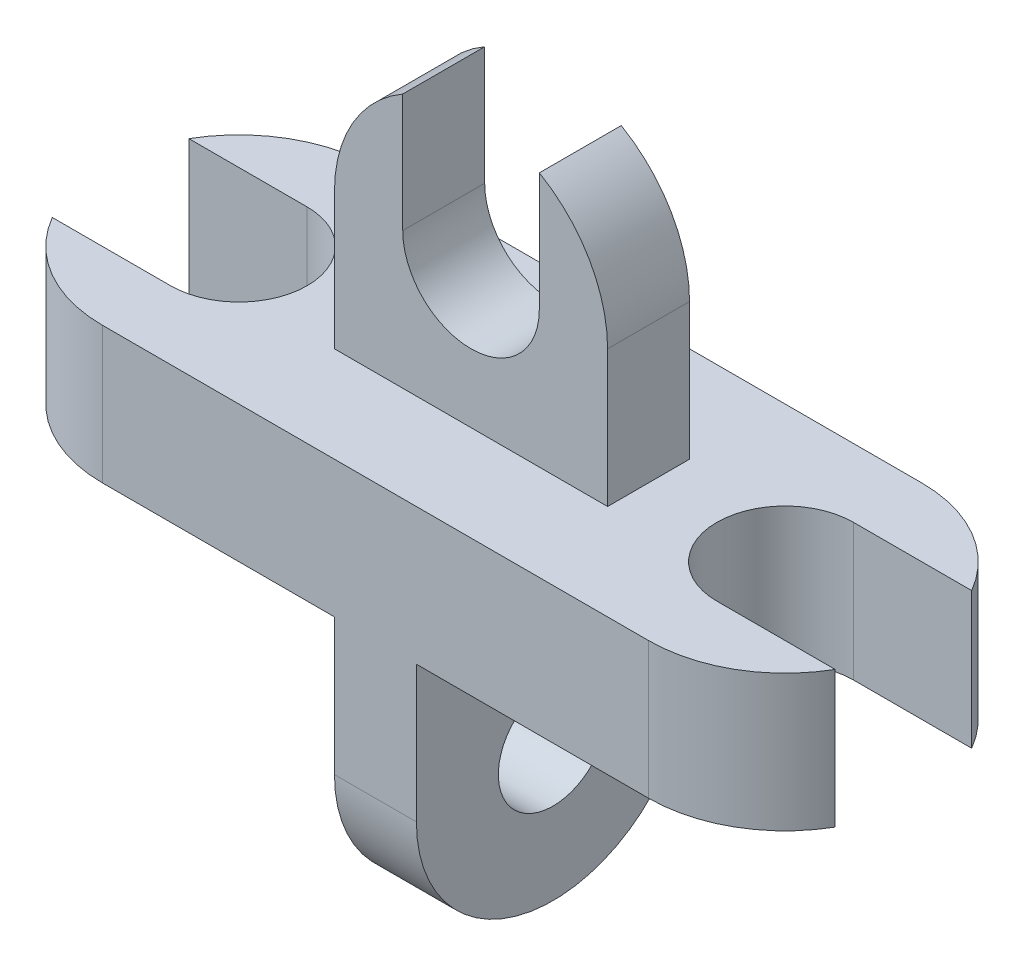
ISO-10303-21;
HEADER;
FILE_DESCRIPTION(('STEP AP214'),'2;1');
FILE_NAME('part.step','',(''),(''),'','','');
FILE_SCHEMA(('AUTOMOTIVE_DESIGN { 1 0 10303 214 1 1 1 1 }'));
ENDSEC;
DATA;
#1=APPLICATION_CONTEXT('core data for automotive mechanical design processes');
#2=APPLICATION_PROTOCOL_DEFINITION('international standard','automotive_design',2000,#1);
#3=PRODUCT_CONTEXT('',#1,'mechanical');
#4=PRODUCT('Part','Part','',(#3));
#5=PRODUCT_RELATED_PRODUCT_CATEGORY('part','',(#4));
#6=PRODUCT_DEFINITION_FORMATION('','',#4);
#7=PRODUCT_DEFINITION_CONTEXT('part definition',#1,'design');
#8=PRODUCT_DEFINITION('design','',#6,#7);
#9=PRODUCT_DEFINITION_SHAPE('','',#8);
#10=(LENGTH_UNIT() NAMED_UNIT(*) SI_UNIT(.MILLI.,.METRE.));
#11=(NAMED_UNIT(*) PLANE_ANGLE_UNIT() SI_UNIT($,.RADIAN.));
#12=(NAMED_UNIT(*) SI_UNIT($,.STERADIAN.) SOLID_ANGLE_UNIT());
#13=UNCERTAINTY_MEASURE_WITH_UNIT(LENGTH_MEASURE(1.E-05),#10,'distance_accuracy_value','');
#14=(GEOMETRIC_REPRESENTATION_CONTEXT(3) GLOBAL_UNCERTAINTY_ASSIGNED_CONTEXT((#13)) GLOBAL_UNIT_ASSIGNED_CONTEXT((#10,
#11,#12)) REPRESENTATION_CONTEXT('',''));
#15=CARTESIAN_POINT('',(0.,0.,0.));
#16=DIRECTION('',(0.,0.,1.));
#17=DIRECTION('',(1.,0.,0.));
#18=AXIS2_PLACEMENT_3D('',#15,#16,#17);
#19=CARTESIAN_POINT('',(100.,-25.,0.));
#20=DIRECTION('',(0.,-1.,0.));
#21=DIRECTION('',(0.,0.,-1.));
#22=AXIS2_PLACEMENT_3D('',#19,#20,#21);
#23=PLANE('',#22);
#24=DIRECTION('',(-1.,0.,0.));
#25=VECTOR('',#24,1.);
#26=CARTESIAN_POINT('',(100.,-25.,-50.));
#27=LINE('',#26,#25);
#28=CARTESIAN_POINT('',(-15.,-25.,-50.));
#29=VERTEX_POINT('',#28);
#30=CARTESIAN_POINT('',(-100.,-25.,-50.));
#31=VERTEX_POINT('',#30);
#32=EDGE_CURVE('E48',#29,#31,#27,.T.);
#33=ORIENTED_EDGE('',*,*,#32,.F.);
#34=DIRECTION('',(0.,0.,1.));
#35=VECTOR('',#34,1.);
#36=CARTESIAN_POINT('',(-15.,-25.,50.));
#37=LINE('',#36,#35);
#38=CARTESIAN_POINT('',(-15.,-25.,50.));
#39=VERTEX_POINT('',#38);
#40=EDGE_CURVE('E401',#29,#39,#37,.T.);
#41=ORIENTED_EDGE('',*,*,#40,.T.);
#42=DIRECTION('',(1.,0.,0.));
#43=VECTOR('',#42,1.);
#44=CARTESIAN_POINT('',(100.,-25.,50.));
#45=LINE('',#44,#43);
#46=CARTESIAN_POINT('',(-100.,-25.,50.));
#47=VERTEX_POINT('',#46);
#48=EDGE_CURVE('E289',#47,#39,#45,.T.);
#49=ORIENTED_EDGE('',*,*,#48,.F.);
#50=CARTESIAN_POINT('',(-100.,-25.,0.));
#51=DIRECTION('',(0.,1.,0.));
#52=DIRECTION('',(0.,0.,1.));
#53=AXIS2_PLACEMENT_3D('',#50,#51,#52);
#54=CIRCLE('',#53,50.);
#55=CARTESIAN_POINT('',(-143.301270189222,-25.,25.));
#56=VERTEX_POINT('',#55);
#57=EDGE_CURVE('E331',#56,#47,#54,.T.);
#58=ORIENTED_EDGE('',*,*,#57,.F.);
#59=DIRECTION('',(-1.,0.,0.));
#60=VECTOR('',#59,1.);
#61=CARTESIAN_POINT('',(-100.,-25.,25.));
#62=LINE('',#61,#60);
#63=CARTESIAN_POINT('',(-100.,-25.,25.));
#64=VERTEX_POINT('',#63);
#65=EDGE_CURVE('E329',#64,#56,#62,.T.);
#66=ORIENTED_EDGE('',*,*,#65,.F.);
#67=CARTESIAN_POINT('',(-100.,-25.,0.));
#68=DIRECTION('',(0.,-1.,0.));
#69=DIRECTION('',(0.,0.,1.));
#70=AXIS2_PLACEMENT_3D('',#67,#68,#69);
#71=CIRCLE('',#70,25.);
#72=CARTESIAN_POINT('',(-100.,-25.,-25.));
#73=VERTEX_POINT('',#72);
#74=EDGE_CURVE('E327',#73,#64,#71,.T.);
#75=ORIENTED_EDGE('',*,*,#74,.F.);
#76=DIRECTION('',(1.,0.,0.));
#77=VECTOR('',#76,1.);
#78=CARTESIAN_POINT('',(-100.,-25.,-25.));
#79=LINE('',#78,#77);
#80=CARTESIAN_POINT('',(-143.301270189222,-25.,-25.));
#81=VERTEX_POINT('',#80);
#82=EDGE_CURVE('E325',#81,#73,#79,.T.);
#83=ORIENTED_EDGE('',*,*,#82,.F.);
#84=CARTESIAN_POINT('',(-100.,-25.,0.));
#85=DIRECTION('',(0.,1.,0.));
#86=DIRECTION('',(0.,0.,1.));
#87=AXIS2_PLACEMENT_3D('',#84,#85,#86);
#88=CIRCLE('',#87,50.);
#89=EDGE_CURVE('E323',#31,#81,#88,.T.);
#90=ORIENTED_EDGE('',*,*,#89,.F.);
#91=EDGE_LOOP('',(#33,#41,#49,#58,#66,#75,#83,#90));
#92=FACE_BOUND('',#91,.T.);
#93=ADVANCED_FACE('F33',(#92),#23,.T.);
#94=CARTESIAN_POINT('',(100.,25.,0.));
#95=DIRECTION('',(0.,-1.,0.));
#96=DIRECTION('',(0.,0.,-1.));
#97=AXIS2_PLACEMENT_3D('',#94,#95,#96);
#98=CYLINDRICAL_SURFACE('',#97,50.0000000000001);
#99=CARTESIAN_POINT('',(100.,-25.,0.));
#100=DIRECTION('',(0.,1.,0.));
#101=DIRECTION('',(0.,0.,-1.));
#102=AXIS2_PLACEMENT_3D('',#99,#100,#101);
#103=CIRCLE('',#102,50.0000000000001);
#104=CARTESIAN_POINT('',(100.,-25.,50.));
#105=VERTEX_POINT('',#104);
#106=CARTESIAN_POINT('',(143.301270189222,-25.,25.));
#107=VERTEX_POINT('',#106);
#108=EDGE_CURVE('E284',#105,#107,#103,.T.);
#109=ORIENTED_EDGE('',*,*,#108,.T.);
#110=DIRECTION('',(0.,-1.,0.));
#111=VECTOR('',#110,1.);
#112=CARTESIAN_POINT('',(143.301270189222,25.,25.));
#113=LINE('',#112,#111);
#114=CARTESIAN_POINT('',(143.301270189222,25.,25.));
#115=VERTEX_POINT('',#114);
#116=EDGE_CURVE('E11',#115,#107,#113,.T.);
#117=ORIENTED_EDGE('',*,*,#116,.F.);
#118=CARTESIAN_POINT('',(100.,25.,0.));
#119=DIRECTION('',(0.,1.,0.));
#120=DIRECTION('',(0.,0.,-1.));
#121=AXIS2_PLACEMENT_3D('',#118,#119,#120);
#122=CIRCLE('',#121,50.0000000000001);
#123=CARTESIAN_POINT('',(100.,25.,50.));
#124=VERTEX_POINT('',#123);
#125=EDGE_CURVE('E285',#124,#115,#122,.T.);
#126=ORIENTED_EDGE('',*,*,#125,.F.);
#127=DIRECTION('',(0.,-1.,0.));
#128=VECTOR('',#127,1.);
#129=CARTESIAN_POINT('',(100.,25.,50.));
#130=LINE('',#129,#128);
#131=EDGE_CURVE('E311',#124,#105,#130,.T.);
#132=ORIENTED_EDGE('',*,*,#131,.T.);
#133=EDGE_LOOP('',(#109,#117,#126,#132));
#134=FACE_BOUND('',#133,.T.);
#135=ADVANCED_FACE('F35',(#134),#98,.T.);
#136=CARTESIAN_POINT('',(100.,25.,25.));
#137=DIRECTION('',(0.,0.,1.));
#138=DIRECTION('',(1.,0.,0.));
#139=AXIS2_PLACEMENT_3D('',#136,#137,#138);
#140=PLANE('',#139);
#141=DIRECTION('',(-1.,0.,0.));
#142=VECTOR('',#141,1.);
#143=CARTESIAN_POINT('',(100.,-25.,25.));
#144=LINE('',#143,#142);
#145=CARTESIAN_POINT('',(100.,-25.,25.));
#146=VERTEX_POINT('',#145);
#147=EDGE_CURVE('E314',#107,#146,#144,.T.);
#148=ORIENTED_EDGE('',*,*,#147,.T.);
#149=DIRECTION('',(0.,-1.,0.));
#150=VECTOR('',#149,1.);
#151=CARTESIAN_POINT('',(100.,25.,25.));
#152=LINE('',#151,#150);
#153=CARTESIAN_POINT('',(100.,25.,25.));
#154=VERTEX_POINT('',#153);
#155=EDGE_CURVE('E41',#154,#146,#152,.T.);
#156=ORIENTED_EDGE('',*,*,#155,.F.);
#157=DIRECTION('',(-1.,0.,0.));
#158=VECTOR('',#157,1.);
#159=CARTESIAN_POINT('',(100.,25.,25.));
#160=LINE('',#159,#158);
#161=EDGE_CURVE('E288',#115,#154,#160,.T.);
#162=ORIENTED_EDGE('',*,*,#161,.F.);
#163=ORIENTED_EDGE('',*,*,#116,.T.);
#164=EDGE_LOOP('',(#148,#156,#162,#163));
#165=FACE_BOUND('',#164,.T.);
#166=ADVANCED_FACE('F389',(#165),#140,.F.);
#167=CARTESIAN_POINT('',(100.,25.,0.));
#168=DIRECTION('',(0.,-1.,0.));
#169=DIRECTION('',(0.,0.,-1.));
#170=AXIS2_PLACEMENT_3D('',#167,#168,#169);
#171=CYLINDRICAL_SURFACE('',#170,25.);
#172=CARTESIAN_POINT('',(100.,-25.,0.));
#173=DIRECTION('',(0.,-1.,0.));
#174=DIRECTION('',(0.,0.,-1.));
#175=AXIS2_PLACEMENT_3D('',#172,#173,#174);
#176=CIRCLE('',#175,25.);
#177=CARTESIAN_POINT('',(100.,-25.,-25.));
#178=VERTEX_POINT('',#177);
#179=EDGE_CURVE('E316',#146,#178,#176,.T.);
#180=ORIENTED_EDGE('',*,*,#179,.T.);
#181=DIRECTION('',(0.,-1.,0.));
#182=VECTOR('',#181,1.);
#183=CARTESIAN_POINT('',(100.,25.,-25.));
#184=LINE('',#183,#182);
#185=CARTESIAN_POINT('',(100.,25.,-25.));
#186=VERTEX_POINT('',#185);
#187=EDGE_CURVE('E361',#186,#178,#184,.T.);
#188=ORIENTED_EDGE('',*,*,#187,.F.);
#189=CARTESIAN_POINT('',(100.,25.,0.));
#190=DIRECTION('',(0.,-1.,0.));
#191=DIRECTION('',(0.,0.,-1.));
#192=AXIS2_PLACEMENT_3D('',#189,#190,#191);
#193=CIRCLE('',#192,25.);
#194=EDGE_CURVE('E291',#154,#186,#193,.T.);
#195=ORIENTED_EDGE('',*,*,#194,.F.);
#196=ORIENTED_EDGE('',*,*,#155,.T.);
#197=EDGE_LOOP('',(#180,#188,#195,#196));
#198=FACE_BOUND('',#197,.T.);
#199=ADVANCED_FACE('F368',(#198),#171,.F.);
#200=CARTESIAN_POINT('',(100.,25.,-25.));
#201=DIRECTION('',(0.,0.,-1.));
#202=DIRECTION('',(-1.,0.,0.));
#203=AXIS2_PLACEMENT_3D('',#200,#201,#202);
#204=PLANE('',#203);
#205=DIRECTION('',(1.,0.,0.));
#206=VECTOR('',#205,1.);
#207=CARTESIAN_POINT('',(100.,-25.,-25.));
#208=LINE('',#207,#206);
#209=CARTESIAN_POINT('',(143.301270189222,-25.,-25.));
#210=VERTEX_POINT('',#209);
#211=EDGE_CURVE('E318',#178,#210,#208,.T.);
#212=ORIENTED_EDGE('',*,*,#211,.T.);
#213=DIRECTION('',(0.,-1.,0.));
#214=VECTOR('',#213,1.);
#215=CARTESIAN_POINT('',(143.301270189222,25.,-25.));
#216=LINE('',#215,#214);
#217=CARTESIAN_POINT('',(143.301270189222,25.,-25.));
#218=VERTEX_POINT('',#217);
#219=EDGE_CURVE('E358',#218,#210,#216,.T.);
#220=ORIENTED_EDGE('',*,*,#219,.F.);
#221=DIRECTION('',(1.,0.,0.));
#222=VECTOR('',#221,1.);
#223=CARTESIAN_POINT('',(100.,25.,-25.));
#224=LINE('',#223,#222);
#225=EDGE_CURVE('E293',#186,#218,#224,.T.);
#226=ORIENTED_EDGE('',*,*,#225,.F.);
#227=ORIENTED_EDGE('',*,*,#187,.T.);
#228=EDGE_LOOP('',(#212,#220,#226,#227));
#229=FACE_BOUND('',#228,.T.);
#230=ADVANCED_FACE('F377',(#229),#204,.F.);
#231=CARTESIAN_POINT('',(100.,25.,0.));
#232=DIRECTION('',(0.,-1.,0.));
#233=DIRECTION('',(0.,0.,-1.));
#234=AXIS2_PLACEMENT_3D('',#231,#232,#233);
#235=CYLINDRICAL_SURFACE('',#234,50.);
#236=CARTESIAN_POINT('',(100.,-25.,0.));
#237=DIRECTION('',(0.,1.,0.));
#238=DIRECTION('',(0.,0.,-1.));
#239=AXIS2_PLACEMENT_3D('',#236,#237,#238);
#240=CIRCLE('',#239,50.);
#241=CARTESIAN_POINT('',(100.,-25.,-50.));
#242=VERTEX_POINT('',#241);
#243=EDGE_CURVE('E320',#210,#242,#240,.T.);
#244=ORIENTED_EDGE('',*,*,#243,.T.);
#245=DIRECTION('',(0.,-1.,0.));
#246=VECTOR('',#245,1.);
#247=CARTESIAN_POINT('',(100.,25.,-50.));
#248=LINE('',#247,#246);
#249=CARTESIAN_POINT('',(100.,25.,-50.));
#250=VERTEX_POINT('',#249);
#251=EDGE_CURVE('E356',#250,#242,#248,.T.);
#252=ORIENTED_EDGE('',*,*,#251,.F.);
#253=CARTESIAN_POINT('',(100.,25.,0.));
#254=DIRECTION('',(0.,1.,0.));
#255=DIRECTION('',(0.,0.,-1.));
#256=AXIS2_PLACEMENT_3D('',#253,#254,#255);
#257=CIRCLE('',#256,50.);
#258=EDGE_CURVE('E295',#218,#250,#257,.T.);
#259=ORIENTED_EDGE('',*,*,#258,.F.);
#260=ORIENTED_EDGE('',*,*,#219,.T.);
#261=EDGE_LOOP('',(#244,#252,#259,#260));
#262=FACE_BOUND('',#261,.T.);
#263=ADVANCED_FACE('F381',(#262),#235,.T.);
#264=CARTESIAN_POINT('',(100.,25.,-50.));
#265=DIRECTION('',(0.,0.,1.));
#266=DIRECTION('',(1.,0.,0.));
#267=AXIS2_PLACEMENT_3D('',#264,#265,#266);
#268=PLANE('',#267);
#269=CARTESIAN_POINT('',(15.,-25.,-50.));
#270=VERTEX_POINT('',#269);
#271=EDGE_CURVE('E202',#242,#270,#27,.T.);
#272=ORIENTED_EDGE('',*,*,#271,.T.);
#273=DIRECTION('',(0.,1.,0.));
#274=VECTOR('',#273,1.);
#275=CARTESIAN_POINT('',(15.,-75.,-50.));
#276=LINE('',#275,#274);
#277=CARTESIAN_POINT('',(15.,-75.,-50.));
#278=VERTEX_POINT('',#277);
#279=EDGE_CURVE('E195',#278,#270,#276,.T.);
#280=ORIENTED_EDGE('',*,*,#279,.F.);
#281=DIRECTION('',(-1.,0.,0.));
#282=VECTOR('',#281,1.);
#283=CARTESIAN_POINT('',(15.,-75.,-50.));
#284=LINE('',#283,#282);
#285=CARTESIAN_POINT('',(-15.,-75.,-50.));
#286=VERTEX_POINT('',#285);
#287=EDGE_CURVE('E199',#278,#286,#284,.T.);
#288=ORIENTED_EDGE('',*,*,#287,.T.);
#289=DIRECTION('',(0.,1.,0.));
#290=VECTOR('',#289,1.);
#291=CARTESIAN_POINT('',(-15.,-75.,-50.));
#292=LINE('',#291,#290);
#293=EDGE_CURVE('E398',#286,#29,#292,.T.);
#294=ORIENTED_EDGE('',*,*,#293,.T.);
#295=ORIENTED_EDGE('',*,*,#32,.T.);
#296=DIRECTION('',(0.,-1.,0.));
#297=VECTOR('',#296,1.);
#298=CARTESIAN_POINT('',(-100.,25.,-50.));
#299=LINE('',#298,#297);
#300=CARTESIAN_POINT('',(-100.,25.,-50.));
#301=VERTEX_POINT('',#300);
#302=EDGE_CURVE('E353',#301,#31,#299,.T.);
#303=ORIENTED_EDGE('',*,*,#302,.F.);
#304=DIRECTION('',(-1.,0.,0.));
#305=VECTOR('',#304,1.);
#306=CARTESIAN_POINT('',(100.,25.,-50.));
#307=LINE('',#306,#305);
#308=EDGE_CURVE('E297',#250,#301,#307,.T.);
#309=ORIENTED_EDGE('',*,*,#308,.F.);
#310=ORIENTED_EDGE('',*,*,#251,.T.);
#311=EDGE_LOOP('',(#272,#280,#288,#294,#295,#303,#309,#310));
#312=FACE_BOUND('',#311,.T.);
#313=ADVANCED_FACE('F197',(#312),#268,.F.);
#314=CARTESIAN_POINT('',(-100.,25.,0.));
#315=DIRECTION('',(0.,-1.,0.));
#316=DIRECTION('',(0.,0.,-1.));
#317=AXIS2_PLACEMENT_3D('',#314,#315,#316);
#318=CYLINDRICAL_SURFACE('',#317,50.);
#319=ORIENTED_EDGE('',*,*,#89,.T.);
#320=DIRECTION('',(0.,-1.,0.));
#321=VECTOR('',#320,1.);
#322=CARTESIAN_POINT('',(-143.301270189222,25.,-25.));
#323=LINE('',#322,#321);
#324=CARTESIAN_POINT('',(-143.301270189222,25.,-25.));
#325=VERTEX_POINT('',#324);
#326=EDGE_CURVE('E350',#325,#81,#323,.T.);
#327=ORIENTED_EDGE('',*,*,#326,.F.);
#328=CARTESIAN_POINT('',(-100.,25.,0.));
#329=DIRECTION('',(0.,1.,0.));
#330=DIRECTION('',(0.,0.,1.));
#331=AXIS2_PLACEMENT_3D('',#328,#329,#330);
#332=CIRCLE('',#331,50.);
#333=EDGE_CURVE('E299',#301,#325,#332,.T.);
#334=ORIENTED_EDGE('',*,*,#333,.F.);
#335=ORIENTED_EDGE('',*,*,#302,.T.);
#336=EDGE_LOOP('',(#319,#327,#334,#335));
#337=FACE_BOUND('',#336,.T.);
#338=ADVANCED_FACE('F410',(#337),#318,.T.);
#339=CARTESIAN_POINT('',(-100.,25.,-25.));
#340=DIRECTION('',(0.,0.,-1.));
#341=DIRECTION('',(-1.,0.,0.));
#342=AXIS2_PLACEMENT_3D('',#339,#340,#341);
#343=PLANE('',#342);
#344=ORIENTED_EDGE('',*,*,#82,.T.);
#345=DIRECTION('',(0.,-1.,0.));
#346=VECTOR('',#345,1.);
#347=CARTESIAN_POINT('',(-100.,25.,-25.));
#348=LINE('',#347,#346);
#349=CARTESIAN_POINT('',(-100.,25.,-25.));
#350=VERTEX_POINT('',#349);
#351=EDGE_CURVE('E347',#350,#73,#348,.T.);
#352=ORIENTED_EDGE('',*,*,#351,.F.);
#353=DIRECTION('',(1.,0.,0.));
#354=VECTOR('',#353,1.);
#355=CARTESIAN_POINT('',(-100.,25.,-25.));
#356=LINE('',#355,#354);
#357=EDGE_CURVE('E301',#325,#350,#356,.T.);
#358=ORIENTED_EDGE('',*,*,#357,.F.);
#359=ORIENTED_EDGE('',*,*,#326,.T.);
#360=EDGE_LOOP('',(#344,#352,#358,#359));
#361=FACE_BOUND('',#360,.T.);
#362=ADVANCED_FACE('F417',(#361),#343,.F.);
#363=CARTESIAN_POINT('',(-100.,25.,0.));
#364=DIRECTION('',(0.,-1.,0.));
#365=DIRECTION('',(0.,0.,-1.));
#366=AXIS2_PLACEMENT_3D('',#363,#364,#365);
#367=CYLINDRICAL_SURFACE('',#366,25.);
#368=ORIENTED_EDGE('',*,*,#74,.T.);
#369=DIRECTION('',(0.,-1.,0.));
#370=VECTOR('',#369,1.);
#371=CARTESIAN_POINT('',(-100.,25.,25.));
#372=LINE('',#371,#370);
#373=CARTESIAN_POINT('',(-100.,25.,25.));
#374=VERTEX_POINT('',#373);
#375=EDGE_CURVE('E344',#374,#64,#372,.T.);
#376=ORIENTED_EDGE('',*,*,#375,.F.);
#377=CARTESIAN_POINT('',(-100.,25.,0.));
#378=DIRECTION('',(0.,-1.,0.));
#379=DIRECTION('',(0.,0.,1.));
#380=AXIS2_PLACEMENT_3D('',#377,#378,#379);
#381=CIRCLE('',#380,25.);
#382=EDGE_CURVE('E303',#350,#374,#381,.T.);
#383=ORIENTED_EDGE('',*,*,#382,.F.);
#384=ORIENTED_EDGE('',*,*,#351,.T.);
#385=EDGE_LOOP('',(#368,#376,#383,#384));
#386=FACE_BOUND('',#385,.T.);
#387=ADVANCED_FACE('F421',(#386),#367,.F.);
#388=CARTESIAN_POINT('',(-100.,25.,25.));
#389=DIRECTION('',(0.,0.,1.));
#390=DIRECTION('',(1.,0.,0.));
#391=AXIS2_PLACEMENT_3D('',#388,#389,#390);
#392=PLANE('',#391);
#393=ORIENTED_EDGE('',*,*,#65,.T.);
#394=DIRECTION('',(0.,-1.,0.));
#395=VECTOR('',#394,1.);
#396=CARTESIAN_POINT('',(-143.301270189222,25.,25.));
#397=LINE('',#396,#395);
#398=CARTESIAN_POINT('',(-143.301270189222,25.,25.));
#399=VERTEX_POINT('',#398);
#400=EDGE_CURVE('E341',#399,#56,#397,.T.);
#401=ORIENTED_EDGE('',*,*,#400,.F.);
#402=DIRECTION('',(-1.,0.,0.));
#403=VECTOR('',#402,1.);
#404=CARTESIAN_POINT('',(-100.,25.,25.));
#405=LINE('',#404,#403);
#406=EDGE_CURVE('E305',#374,#399,#405,.T.);
#407=ORIENTED_EDGE('',*,*,#406,.F.);
#408=ORIENTED_EDGE('',*,*,#375,.T.);
#409=EDGE_LOOP('',(#393,#401,#407,#408));
#410=FACE_BOUND('',#409,.T.);
#411=ADVANCED_FACE('F428',(#410),#392,.F.);
#412=CARTESIAN_POINT('',(-100.,25.,0.));
#413=DIRECTION('',(0.,-1.,0.));
#414=DIRECTION('',(0.,0.,-1.));
#415=AXIS2_PLACEMENT_3D('',#412,#413,#414);
#416=CYLINDRICAL_SURFACE('',#415,50.);
#417=ORIENTED_EDGE('',*,*,#57,.T.);
#418=DIRECTION('',(0.,-1.,0.));
#419=VECTOR('',#418,1.);
#420=CARTESIAN_POINT('',(-100.,25.,50.));
#421=LINE('',#420,#419);
#422=CARTESIAN_POINT('',(-100.,25.,50.));
#423=VERTEX_POINT('',#422);
#424=EDGE_CURVE('E338',#423,#47,#421,.T.);
#425=ORIENTED_EDGE('',*,*,#424,.F.);
#426=CARTESIAN_POINT('',(-100.,25.,0.));
#427=DIRECTION('',(0.,1.,0.));
#428=DIRECTION('',(0.,0.,1.));
#429=AXIS2_PLACEMENT_3D('',#426,#427,#428);
#430=CIRCLE('',#429,50.);
#431=EDGE_CURVE('E307',#399,#423,#430,.T.);
#432=ORIENTED_EDGE('',*,*,#431,.F.);
#433=ORIENTED_EDGE('',*,*,#400,.T.);
#434=EDGE_LOOP('',(#417,#425,#432,#433));
#435=FACE_BOUND('',#434,.T.);
#436=ADVANCED_FACE('F431',(#435),#416,.T.);
#437=CARTESIAN_POINT('',(100.,25.,50.));
#438=DIRECTION('',(0.,0.,-1.));
#439=DIRECTION('',(-1.,0.,0.));
#440=AXIS2_PLACEMENT_3D('',#437,#438,#439);
#441=PLANE('',#440);
#442=ORIENTED_EDGE('',*,*,#48,.T.);
#443=DIRECTION('',(0.,-1.,0.));
#444=VECTOR('',#443,1.);
#445=CARTESIAN_POINT('',(-15.,-75.,50.));
#446=LINE('',#445,#444);
#447=CARTESIAN_POINT('',(-15.,-75.,50.));
#448=VERTEX_POINT('',#447);
#449=EDGE_CURVE('E214',#39,#448,#446,.T.);
#450=ORIENTED_EDGE('',*,*,#449,.T.);
#451=DIRECTION('',(-1.,0.,0.));
#452=VECTOR('',#451,1.);
#453=CARTESIAN_POINT('',(15.,-75.,50.));
#454=LINE('',#453,#452);
#455=CARTESIAN_POINT('',(15.,-75.,50.));
#456=VERTEX_POINT('',#455);
#457=EDGE_CURVE('E220',#456,#448,#454,.T.);
#458=ORIENTED_EDGE('',*,*,#457,.F.);
#459=DIRECTION('',(0.,-1.,0.));
#460=VECTOR('',#459,1.);
#461=CARTESIAN_POINT('',(15.,-75.,50.));
#462=LINE('',#461,#460);
#463=CARTESIAN_POINT('',(15.,-25.,50.));
#464=VERTEX_POINT('',#463);
#465=EDGE_CURVE('E210',#464,#456,#462,.T.);
#466=ORIENTED_EDGE('',*,*,#465,.F.);
#467=EDGE_CURVE('E333',#464,#105,#45,.T.);
#468=ORIENTED_EDGE('',*,*,#467,.T.);
#469=ORIENTED_EDGE('',*,*,#131,.F.);
#470=DIRECTION('',(1.,0.,0.));
#471=VECTOR('',#470,1.);
#472=CARTESIAN_POINT('',(100.,25.,50.));
#473=LINE('',#472,#471);
#474=EDGE_CURVE('E309',#423,#124,#473,.T.);
#475=ORIENTED_EDGE('',*,*,#474,.F.);
#476=ORIENTED_EDGE('',*,*,#424,.T.);
#477=EDGE_LOOP('',(#442,#450,#458,#466,#468,#469,#475,#476));
#478=FACE_BOUND('',#477,.T.);
#479=ADVANCED_FACE('F394',(#478),#441,.F.);
#480=CARTESIAN_POINT('',(100.,25.,0.));
#481=DIRECTION('',(0.,-1.,0.));
#482=DIRECTION('',(0.,0.,-1.));
#483=AXIS2_PLACEMENT_3D('',#480,#481,#482);
#484=PLANE('',#483);
#485=DIRECTION('',(0.,0.,-1.));
#486=VECTOR('',#485,1.);
#487=CARTESIAN_POINT('',(50.,25.,15.));
#488=LINE('',#487,#486);
#489=CARTESIAN_POINT('',(50.,25.,15.));
#490=VERTEX_POINT('',#489);
#491=CARTESIAN_POINT('',(50.,25.,-15.));
#492=VERTEX_POINT('',#491);
#493=EDGE_CURVE('E264',#490,#492,#488,.T.);
#494=ORIENTED_EDGE('',*,*,#493,.F.);
#495=DIRECTION('',(1.,0.,0.));
#496=VECTOR('',#495,1.);
#497=CARTESIAN_POINT('',(-50.,25.,15.));
#498=LINE('',#497,#496);
#499=CARTESIAN_POINT('',(-50.,25.,15.));
#500=VERTEX_POINT('',#499);
#501=EDGE_CURVE('E243',#500,#490,#498,.T.);
#502=ORIENTED_EDGE('',*,*,#501,.F.);
#503=DIRECTION('',(0.,0.,-1.));
#504=VECTOR('',#503,1.);
#505=CARTESIAN_POINT('',(-50.,25.,15.));
#506=LINE('',#505,#504);
#507=CARTESIAN_POINT('',(-50.,25.,-15.));
#508=VERTEX_POINT('',#507);
#509=EDGE_CURVE('E267',#500,#508,#506,.T.);
#510=ORIENTED_EDGE('',*,*,#509,.T.);
#511=DIRECTION('',(1.,0.,0.));
#512=VECTOR('',#511,1.);
#513=CARTESIAN_POINT('',(-50.,25.,-15.));
#514=LINE('',#513,#512);
#515=EDGE_CURVE('E259',#508,#492,#514,.T.);
#516=ORIENTED_EDGE('',*,*,#515,.T.);
#517=EDGE_LOOP('',(#494,#502,#510,#516));
#518=FACE_BOUND('',#517,.T.);
#519=ORIENTED_EDGE('',*,*,#125,.T.);
#520=ORIENTED_EDGE('',*,*,#161,.T.);
#521=ORIENTED_EDGE('',*,*,#194,.T.);
#522=ORIENTED_EDGE('',*,*,#225,.T.);
#523=ORIENTED_EDGE('',*,*,#258,.T.);
#524=ORIENTED_EDGE('',*,*,#308,.T.);
#525=ORIENTED_EDGE('',*,*,#333,.T.);
#526=ORIENTED_EDGE('',*,*,#357,.T.);
#527=ORIENTED_EDGE('',*,*,#382,.T.);
#528=ORIENTED_EDGE('',*,*,#406,.T.);
#529=ORIENTED_EDGE('',*,*,#431,.T.);
#530=ORIENTED_EDGE('',*,*,#474,.T.);
#531=EDGE_LOOP('',(#519,#520,#521,#522,#523,#524,#525,#526,#527,#528,#529,#530));
#532=FACE_BOUND('',#531,.T.);
#533=ADVANCED_FACE('F385',(#518,#532),#484,.F.);
#534=DIRECTION('',(0.,0.,1.));
#535=VECTOR('',#534,1.);
#536=CARTESIAN_POINT('',(15.,-25.,50.));
#537=LINE('',#536,#535);
#538=EDGE_CURVE('E56',#270,#464,#537,.T.);
#539=ORIENTED_EDGE('',*,*,#538,.F.);
#540=ORIENTED_EDGE('',*,*,#271,.F.);
#541=ORIENTED_EDGE('',*,*,#243,.F.);
#542=ORIENTED_EDGE('',*,*,#211,.F.);
#543=ORIENTED_EDGE('',*,*,#179,.F.);
#544=ORIENTED_EDGE('',*,*,#147,.F.);
#545=ORIENTED_EDGE('',*,*,#108,.F.);
#546=ORIENTED_EDGE('',*,*,#467,.F.);
#547=EDGE_LOOP('',(#539,#540,#541,#542,#543,#544,#545,#546));
#548=FACE_BOUND('',#547,.T.);
#549=ADVANCED_FACE('F372',(#548),#23,.T.);
#550=CARTESIAN_POINT('',(0.,75.,15.));
#551=DIRECTION('',(0.,0.,-1.));
#552=DIRECTION('',(-1.,0.,0.));
#553=AXIS2_PLACEMENT_3D('',#550,#551,#552);
#554=CYLINDRICAL_SURFACE('',#553,50.);
#555=CARTESIAN_POINT('',(0.,75.,-15.));
#556=DIRECTION('',(0.,0.,1.));
#557=DIRECTION('',(1.,0.,0.));
#558=AXIS2_PLACEMENT_3D('',#555,#556,#557);
#559=CIRCLE('',#558,50.);
#560=CARTESIAN_POINT('',(50.,75.,-15.));
#561=VERTEX_POINT('',#560);
#562=CARTESIAN_POINT('',(25.,118.301270189222,-15.));
#563=VERTEX_POINT('',#562);
#564=EDGE_CURVE('E219',#561,#563,#559,.T.);
#565=ORIENTED_EDGE('',*,*,#564,.T.);
#566=DIRECTION('',(0.,0.,-1.));
#567=VECTOR('',#566,1.);
#568=CARTESIAN_POINT('',(25.,118.301270189222,15.));
#569=LINE('',#568,#567);
#570=CARTESIAN_POINT('',(25.,118.301270189222,15.));
#571=VERTEX_POINT('',#570);
#572=EDGE_CURVE('E281',#571,#563,#569,.T.);
#573=ORIENTED_EDGE('',*,*,#572,.F.);
#574=CARTESIAN_POINT('',(0.,75.,15.));
#575=DIRECTION('',(0.,0.,1.));
#576=DIRECTION('',(1.,0.,0.));
#577=AXIS2_PLACEMENT_3D('',#574,#575,#576);
#578=CIRCLE('',#577,50.);
#579=CARTESIAN_POINT('',(50.,75.,15.));
#580=VERTEX_POINT('',#579);
#581=EDGE_CURVE('E228',#580,#571,#578,.T.);
#582=ORIENTED_EDGE('',*,*,#581,.F.);
#583=DIRECTION('',(0.,0.,-1.));
#584=VECTOR('',#583,1.);
#585=CARTESIAN_POINT('',(50.,75.,15.));
#586=LINE('',#585,#584);
#587=EDGE_CURVE('E247',#580,#561,#586,.T.);
#588=ORIENTED_EDGE('',*,*,#587,.T.);
#589=EDGE_LOOP('',(#565,#573,#582,#588));
#590=FACE_BOUND('',#589,.T.);
#591=ADVANCED_FACE('F448',(#590),#554,.T.);
#592=CARTESIAN_POINT('',(25.,75.,15.));
#593=DIRECTION('',(1.,0.,0.));
#594=DIRECTION('',(0.,0.,-1.));
#595=AXIS2_PLACEMENT_3D('',#592,#593,#594);
#596=PLANE('',#595);
#597=DIRECTION('',(0.,-1.,0.));
#598=VECTOR('',#597,1.);
#599=CARTESIAN_POINT('',(25.,75.,-15.));
#600=LINE('',#599,#598);
#601=CARTESIAN_POINT('',(25.,75.,-15.));
#602=VERTEX_POINT('',#601);
#603=EDGE_CURVE('E223',#563,#602,#600,.T.);
#604=ORIENTED_EDGE('',*,*,#603,.T.);
#605=DIRECTION('',(0.,0.,-1.));
#606=VECTOR('',#605,1.);
#607=CARTESIAN_POINT('',(25.,75.,15.));
#608=LINE('',#607,#606);
#609=CARTESIAN_POINT('',(25.,75.,15.));
#610=VERTEX_POINT('',#609);
#611=EDGE_CURVE('E278',#610,#602,#608,.T.);
#612=ORIENTED_EDGE('',*,*,#611,.F.);
#613=DIRECTION('',(0.,-1.,0.));
#614=VECTOR('',#613,1.);
#615=CARTESIAN_POINT('',(25.,75.,15.));
#616=LINE('',#615,#614);
#617=EDGE_CURVE('E231',#571,#610,#616,.T.);
#618=ORIENTED_EDGE('',*,*,#617,.F.);
#619=ORIENTED_EDGE('',*,*,#572,.T.);
#620=EDGE_LOOP('',(#604,#612,#618,#619));
#621=FACE_BOUND('',#620,.T.);
#622=ADVANCED_FACE('F453',(#621),#596,.F.);
#623=CARTESIAN_POINT('',(0.,75.,15.));
#624=DIRECTION('',(0.,0.,-1.));
#625=DIRECTION('',(-1.,0.,0.));
#626=AXIS2_PLACEMENT_3D('',#623,#624,#625);
#627=CYLINDRICAL_SURFACE('',#626,25.);
#628=CARTESIAN_POINT('',(0.,75.,-15.));
#629=DIRECTION('',(0.,0.,-1.));
#630=DIRECTION('',(1.,0.,0.));
#631=AXIS2_PLACEMENT_3D('',#628,#629,#630);
#632=CIRCLE('',#631,25.);
#633=CARTESIAN_POINT('',(-25.,75.,-15.));
#634=VERTEX_POINT('',#633);
#635=EDGE_CURVE('E250',#602,#634,#632,.T.);
#636=ORIENTED_EDGE('',*,*,#635,.T.);
#637=DIRECTION('',(0.,0.,-1.));
#638=VECTOR('',#637,1.);
#639=CARTESIAN_POINT('',(-25.,75.,15.));
#640=LINE('',#639,#638);
#641=CARTESIAN_POINT('',(-25.,75.,15.));
#642=VERTEX_POINT('',#641);
#643=EDGE_CURVE('E275',#642,#634,#640,.T.);
#644=ORIENTED_EDGE('',*,*,#643,.F.);
#645=CARTESIAN_POINT('',(0.,75.,15.));
#646=DIRECTION('',(0.,0.,-1.));
#647=DIRECTION('',(1.,0.,0.));
#648=AXIS2_PLACEMENT_3D('',#645,#646,#647);
#649=CIRCLE('',#648,25.);
#650=EDGE_CURVE('E234',#610,#642,#649,.T.);
#651=ORIENTED_EDGE('',*,*,#650,.F.);
#652=ORIENTED_EDGE('',*,*,#611,.T.);
#653=EDGE_LOOP('',(#636,#644,#651,#652));
#654=FACE_BOUND('',#653,.T.);
#655=ADVANCED_FACE('F462',(#654),#627,.F.);
#656=CARTESIAN_POINT('',(-25.,75.,15.));
#657=DIRECTION('',(-1.,0.,0.));
#658=DIRECTION('',(0.,0.,1.));
#659=AXIS2_PLACEMENT_3D('',#656,#657,#658);
#660=PLANE('',#659);
#661=DIRECTION('',(0.,1.,0.));
#662=VECTOR('',#661,1.);
#663=CARTESIAN_POINT('',(-25.,75.,-15.));
#664=LINE('',#663,#662);
#665=CARTESIAN_POINT('',(-25.,118.301270189222,-15.));
#666=VERTEX_POINT('',#665);
#667=EDGE_CURVE('E252',#634,#666,#664,.T.);
#668=ORIENTED_EDGE('',*,*,#667,.T.);
#669=DIRECTION('',(0.,0.,-1.));
#670=VECTOR('',#669,1.);
#671=CARTESIAN_POINT('',(-25.,118.301270189222,15.));
#672=LINE('',#671,#670);
#673=CARTESIAN_POINT('',(-25.,118.301270189222,15.));
#674=VERTEX_POINT('',#673);
#675=EDGE_CURVE('E272',#674,#666,#672,.T.);
#676=ORIENTED_EDGE('',*,*,#675,.F.);
#677=DIRECTION('',(0.,1.,0.));
#678=VECTOR('',#677,1.);
#679=CARTESIAN_POINT('',(-25.,75.,15.));
#680=LINE('',#679,#678);
#681=EDGE_CURVE('E236',#642,#674,#680,.T.);
#682=ORIENTED_EDGE('',*,*,#681,.F.);
#683=ORIENTED_EDGE('',*,*,#643,.T.);
#684=EDGE_LOOP('',(#668,#676,#682,#683));
#685=FACE_BOUND('',#684,.T.);
#686=ADVANCED_FACE('F466',(#685),#660,.F.);
#687=CARTESIAN_POINT('',(0.,75.,15.));
#688=DIRECTION('',(0.,0.,-1.));
#689=DIRECTION('',(-1.,0.,0.));
#690=AXIS2_PLACEMENT_3D('',#687,#688,#689);
#691=CYLINDRICAL_SURFACE('',#690,50.);
#692=CARTESIAN_POINT('',(0.,75.,-15.));
#693=DIRECTION('',(0.,0.,1.));
#694=DIRECTION('',(1.,0.,0.));
#695=AXIS2_PLACEMENT_3D('',#692,#693,#694);
#696=CIRCLE('',#695,50.);
#697=CARTESIAN_POINT('',(-50.,75.,-15.));
#698=VERTEX_POINT('',#697);
#699=EDGE_CURVE('E254',#666,#698,#696,.T.);
#700=ORIENTED_EDGE('',*,*,#699,.T.);
#701=DIRECTION('',(0.,0.,-1.));
#702=VECTOR('',#701,1.);
#703=CARTESIAN_POINT('',(-50.,75.,15.));
#704=LINE('',#703,#702);
#705=CARTESIAN_POINT('',(-50.,75.,15.));
#706=VERTEX_POINT('',#705);
#707=EDGE_CURVE('E269',#706,#698,#704,.T.);
#708=ORIENTED_EDGE('',*,*,#707,.F.);
#709=CARTESIAN_POINT('',(0.,75.,15.));
#710=DIRECTION('',(0.,0.,1.));
#711=DIRECTION('',(1.,0.,0.));
#712=AXIS2_PLACEMENT_3D('',#709,#710,#711);
#713=CIRCLE('',#712,50.);
#714=EDGE_CURVE('E238',#674,#706,#713,.T.);
#715=ORIENTED_EDGE('',*,*,#714,.F.);
#716=ORIENTED_EDGE('',*,*,#675,.T.);
#717=EDGE_LOOP('',(#700,#708,#715,#716));
#718=FACE_BOUND('',#717,.T.);
#719=ADVANCED_FACE('F470',(#718),#691,.T.);
#720=CARTESIAN_POINT('',(-50.,75.,15.));
#721=DIRECTION('',(1.,0.,0.));
#722=DIRECTION('',(0.,1.,0.));
#723=AXIS2_PLACEMENT_3D('',#720,#721,#722);
#724=PLANE('',#723);
#725=DIRECTION('',(0.,-1.,0.));
#726=VECTOR('',#725,1.);
#727=CARTESIAN_POINT('',(-50.,75.,-15.));
#728=LINE('',#727,#726);
#729=EDGE_CURVE('E256',#698,#508,#728,.T.);
#730=ORIENTED_EDGE('',*,*,#729,.T.);
#731=ORIENTED_EDGE('',*,*,#509,.F.);
#732=DIRECTION('',(0.,-1.,0.));
#733=VECTOR('',#732,1.);
#734=CARTESIAN_POINT('',(-50.,75.,15.));
#735=LINE('',#734,#733);
#736=EDGE_CURVE('E240',#706,#500,#735,.T.);
#737=ORIENTED_EDGE('',*,*,#736,.F.);
#738=ORIENTED_EDGE('',*,*,#707,.T.);
#739=EDGE_LOOP('',(#730,#731,#737,#738));
#740=FACE_BOUND('',#739,.T.);
#741=ADVANCED_FACE('F474',(#740),#724,.F.);
#742=CARTESIAN_POINT('',(50.,75.,15.));
#743=DIRECTION('',(-1.,0.,0.));
#744=DIRECTION('',(0.,-1.,0.));
#745=AXIS2_PLACEMENT_3D('',#742,#743,#744);
#746=PLANE('',#745);
#747=DIRECTION('',(0.,1.,0.));
#748=VECTOR('',#747,1.);
#749=CARTESIAN_POINT('',(50.,75.,-15.));
#750=LINE('',#749,#748);
#751=EDGE_CURVE('E232',#492,#561,#750,.T.);
#752=ORIENTED_EDGE('',*,*,#751,.T.);
#753=ORIENTED_EDGE('',*,*,#587,.F.);
#754=DIRECTION('',(0.,1.,0.));
#755=VECTOR('',#754,1.);
#756=CARTESIAN_POINT('',(50.,75.,15.));
#757=LINE('',#756,#755);
#758=EDGE_CURVE('E246',#490,#580,#757,.T.);
#759=ORIENTED_EDGE('',*,*,#758,.F.);
#760=ORIENTED_EDGE('',*,*,#493,.T.);
#761=EDGE_LOOP('',(#752,#753,#759,#760));
#762=FACE_BOUND('',#761,.T.);
#763=ADVANCED_FACE('F478',(#762),#746,.F.);
#764=CARTESIAN_POINT('',(0.,75.,15.));
#765=DIRECTION('',(0.,0.,1.));
#766=DIRECTION('',(1.,0.,0.));
#767=AXIS2_PLACEMENT_3D('',#764,#765,#766);
#768=PLANE('',#767);
#769=ORIENTED_EDGE('',*,*,#581,.T.);
#770=ORIENTED_EDGE('',*,*,#617,.T.);
#771=ORIENTED_EDGE('',*,*,#650,.T.);
#772=ORIENTED_EDGE('',*,*,#681,.T.);
#773=ORIENTED_EDGE('',*,*,#714,.T.);
#774=ORIENTED_EDGE('',*,*,#736,.T.);
#775=ORIENTED_EDGE('',*,*,#501,.T.);
#776=ORIENTED_EDGE('',*,*,#758,.T.);
#777=EDGE_LOOP('',(#769,#770,#771,#772,#773,#774,#775,#776));
#778=FACE_BOUND('',#777,.T.);
#779=ADVANCED_FACE('F482',(#778),#768,.T.);
#780=CARTESIAN_POINT('',(0.,75.,-15.));
#781=DIRECTION('',(0.,0.,1.));
#782=DIRECTION('',(1.,0.,0.));
#783=AXIS2_PLACEMENT_3D('',#780,#781,#782);
#784=PLANE('',#783);
#785=ORIENTED_EDGE('',*,*,#564,.F.);
#786=ORIENTED_EDGE('',*,*,#751,.F.);
#787=ORIENTED_EDGE('',*,*,#515,.F.);
#788=ORIENTED_EDGE('',*,*,#729,.F.);
#789=ORIENTED_EDGE('',*,*,#699,.F.);
#790=ORIENTED_EDGE('',*,*,#667,.F.);
#791=ORIENTED_EDGE('',*,*,#635,.F.);
#792=ORIENTED_EDGE('',*,*,#603,.F.);
#793=EDGE_LOOP('',(#785,#786,#787,#788,#789,#790,#791,#792));
#794=FACE_BOUND('',#793,.T.);
#795=ADVANCED_FACE('F484',(#794),#784,.F.);
#796=CARTESIAN_POINT('',(15.,-75.,0.));
#797=DIRECTION('',(1.,0.,0.));
#798=DIRECTION('',(0.,0.,-1.));
#799=AXIS2_PLACEMENT_3D('',#796,#797,#798);
#800=PLANE('',#799);
#801=CARTESIAN_POINT('',(15.,-75.,0.));
#802=DIRECTION('',(1.,0.,0.));
#803=DIRECTION('',(0.,0.,-1.));
#804=AXIS2_PLACEMENT_3D('',#801,#802,#803);
#805=CIRCLE('',#804,50.);
#806=EDGE_CURVE('E204',#456,#278,#805,.T.);
#807=ORIENTED_EDGE('',*,*,#806,.T.);
#808=ORIENTED_EDGE('',*,*,#279,.T.);
#809=ORIENTED_EDGE('',*,*,#538,.T.);
#810=ORIENTED_EDGE('',*,*,#465,.T.);
#811=EDGE_LOOP('',(#807,#808,#809,#810));
#812=FACE_BOUND('',#811,.T.);
#813=CARTESIAN_POINT('',(15.,-75.,0.));
#814=DIRECTION('',(1.,0.,0.));
#815=DIRECTION('',(0.,0.,-1.));
#816=AXIS2_PLACEMENT_3D('',#813,#814,#815);
#817=CIRCLE('',#816,20.);
#818=CARTESIAN_POINT('',(15.,-75.,-20.));
#819=VERTEX_POINT('',#818);
#820=EDGE_CURVE('E399',#819,#819,#817,.T.);
#821=ORIENTED_EDGE('',*,*,#820,.F.);
#822=EDGE_LOOP('',(#821));
#823=FACE_BOUND('',#822,.T.);
#824=ADVANCED_FACE('F207',(#812,#823),#800,.T.);
#825=CARTESIAN_POINT('',(-15.,-75.,0.));
#826=DIRECTION('',(1.,0.,0.));
#827=DIRECTION('',(0.,0.,-1.));
#828=AXIS2_PLACEMENT_3D('',#825,#826,#827);
#829=PLANE('',#828);
#830=CARTESIAN_POINT('',(-15.,-75.,0.));
#831=DIRECTION('',(1.,0.,0.));
#832=DIRECTION('',(0.,0.,-1.));
#833=AXIS2_PLACEMENT_3D('',#830,#831,#832);
#834=CIRCLE('',#833,50.);
#835=EDGE_CURVE('E218',#448,#286,#834,.T.);
#836=ORIENTED_EDGE('',*,*,#835,.F.);
#837=ORIENTED_EDGE('',*,*,#449,.F.);
#838=ORIENTED_EDGE('',*,*,#40,.F.);
#839=ORIENTED_EDGE('',*,*,#293,.F.);
#840=EDGE_LOOP('',(#836,#837,#838,#839));
#841=FACE_BOUND('',#840,.T.);
#842=CARTESIAN_POINT('',(-15.,-75.,0.));
#843=DIRECTION('',(1.,0.,0.));
#844=DIRECTION('',(0.,0.,-1.));
#845=AXIS2_PLACEMENT_3D('',#842,#843,#844);
#846=CIRCLE('',#845,20.);
#847=CARTESIAN_POINT('',(-15.,-75.,-20.));
#848=VERTEX_POINT('',#847);
#849=EDGE_CURVE('E507',#848,#848,#846,.T.);
#850=ORIENTED_EDGE('',*,*,#849,.T.);
#851=EDGE_LOOP('',(#850));
#852=FACE_BOUND('',#851,.T.);
#853=ADVANCED_FACE('F406',(#841,#852),#829,.F.);
#854=CARTESIAN_POINT('',(15.,-75.,0.));
#855=DIRECTION('',(-1.,0.,0.));
#856=DIRECTION('',(0.,0.,1.));
#857=AXIS2_PLACEMENT_3D('',#854,#855,#856);
#858=CYLINDRICAL_SURFACE('',#857,50.);
#859=ORIENTED_EDGE('',*,*,#835,.T.);
#860=ORIENTED_EDGE('',*,*,#287,.F.);
#861=ORIENTED_EDGE('',*,*,#806,.F.);
#862=ORIENTED_EDGE('',*,*,#457,.T.);
#863=EDGE_LOOP('',(#859,#860,#861,#862));
#864=FACE_BOUND('',#863,.T.);
#865=ADVANCED_FACE('F216',(#864),#858,.T.);
#866=CARTESIAN_POINT('',(15.,-75.,0.));
#867=DIRECTION('',(-1.,0.,0.));
#868=DIRECTION('',(0.,0.,1.));
#869=AXIS2_PLACEMENT_3D('',#866,#867,#868);
#870=CYLINDRICAL_SURFACE('',#869,20.);
#871=ORIENTED_EDGE('',*,*,#820,.T.);
#872=EDGE_LOOP('',(#871));
#873=FACE_BOUND('',#872,.T.);
#874=ORIENTED_EDGE('',*,*,#849,.F.);
#875=EDGE_LOOP('',(#874));
#876=FACE_BOUND('',#875,.T.);
#877=ADVANCED_FACE('F493',(#873,#876),#870,.F.);
#878=CLOSED_SHELL('',(#93,#135,#166,#199,#230,#263,#313,#338,#362,#387,#411,#436,#479,#533,#549,
#591,#622,#655,#686,#719,#741,#763,#779,#795,#824,#853,#865,#877));
#879=MANIFOLD_SOLID_BREP('B2',#878);
#880=ADVANCED_BREP_SHAPE_REPRESENTATION('',(#18,#879),#14);
#881=SHAPE_DEFINITION_REPRESENTATION(#9,#880);
ENDSEC;
END-ISO-10303-21;
